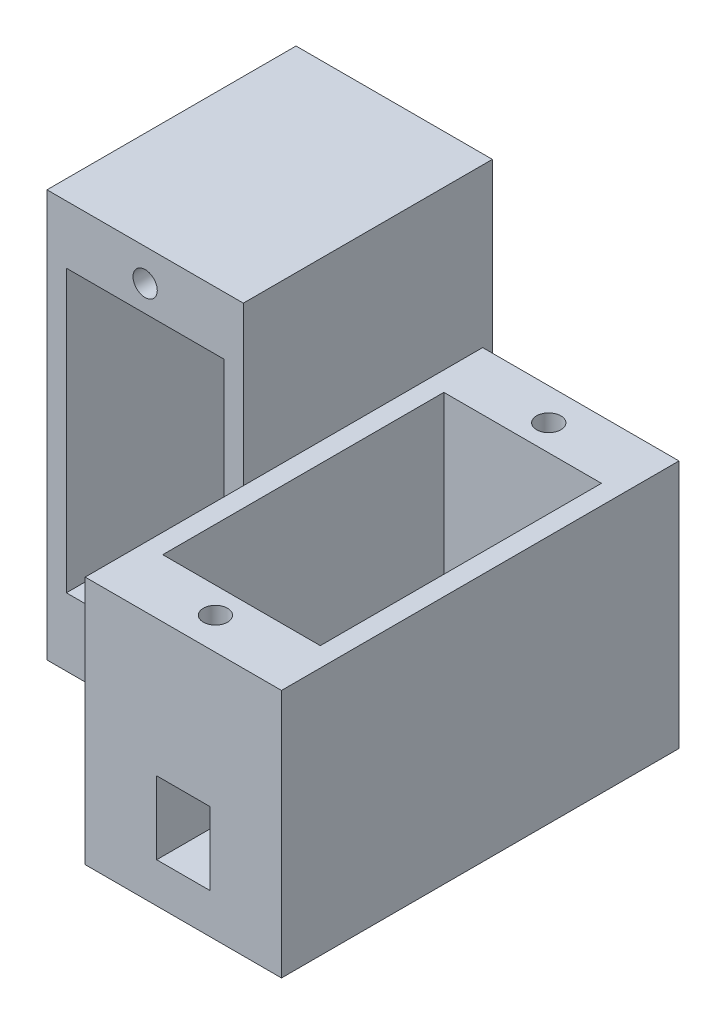
ISO-10303-21;
HEADER;
FILE_DESCRIPTION(('STEP AP214'),'2;1');
FILE_NAME('part.step','',(''),(''),'','','');
FILE_SCHEMA(('AUTOMOTIVE_DESIGN { 1 0 10303 214 1 1 1 1 }'));
ENDSEC;
DATA;
#1=APPLICATION_CONTEXT('core data for automotive mechanical design processes');
#2=APPLICATION_PROTOCOL_DEFINITION('international standard','automotive_design',2000,#1);
#3=PRODUCT_CONTEXT('',#1,'mechanical');
#4=PRODUCT('Part','Part','',(#3));
#5=PRODUCT_RELATED_PRODUCT_CATEGORY('part','',(#4));
#6=PRODUCT_DEFINITION_FORMATION('','',#4);
#7=PRODUCT_DEFINITION_CONTEXT('part definition',#1,'design');
#8=PRODUCT_DEFINITION('design','',#6,#7);
#9=PRODUCT_DEFINITION_SHAPE('','',#8);
#10=(LENGTH_UNIT() NAMED_UNIT(*) SI_UNIT(.MILLI.,.METRE.));
#11=(NAMED_UNIT(*) PLANE_ANGLE_UNIT() SI_UNIT($,.RADIAN.));
#12=(NAMED_UNIT(*) SI_UNIT($,.STERADIAN.) SOLID_ANGLE_UNIT());
#13=UNCERTAINTY_MEASURE_WITH_UNIT(LENGTH_MEASURE(1.E-05),#10,'distance_accuracy_value','');
#14=(GEOMETRIC_REPRESENTATION_CONTEXT(3) GLOBAL_UNCERTAINTY_ASSIGNED_CONTEXT((#13)) GLOBAL_UNIT_ASSIGNED_CONTEXT((#10,
#11,#12)) REPRESENTATION_CONTEXT('',''));
#15=CARTESIAN_POINT('',(0.,0.,0.));
#16=DIRECTION('',(0.,0.,1.));
#17=DIRECTION('',(1.,0.,0.));
#18=AXIS2_PLACEMENT_3D('',#15,#16,#17);
#19=CARTESIAN_POINT('',(-8.1,27.35,10.9));
#20=DIRECTION('',(1.,0.,0.));
#21=DIRECTION('',(0.,0.,-1.));
#22=AXIS2_PLACEMENT_3D('',#19,#20,#21);
#23=PLANE('',#22);
#24=DIRECTION('',(0.,1.,0.));
#25=VECTOR('',#24,1.);
#26=CARTESIAN_POINT('',(-8.1,7.6,-2.15));
#27=LINE('',#26,#25);
#28=CARTESIAN_POINT('',(-8.1,6.8,-2.15));
#29=VERTEX_POINT('',#28);
#30=CARTESIAN_POINT('',(-8.1,27.35,-2.15));
#31=VERTEX_POINT('',#30);
#32=EDGE_CURVE('E449',#29,#31,#27,.T.);
#33=ORIENTED_EDGE('',*,*,#32,.F.);
#34=DIRECTION('',(0.,0.,1.));
#35=VECTOR('',#34,1.);
#36=CARTESIAN_POINT('',(-8.1,6.8,10.9));
#37=LINE('',#36,#35);
#38=CARTESIAN_POINT('',(-8.1,6.8,10.9));
#39=VERTEX_POINT('',#38);
#40=EDGE_CURVE('E470',#29,#39,#37,.T.);
#41=ORIENTED_EDGE('',*,*,#40,.T.);
#42=DIRECTION('',(0.,-1.,0.));
#43=VECTOR('',#42,1.);
#44=CARTESIAN_POINT('',(-8.1,27.35,10.9));
#45=LINE('',#44,#43);
#46=CARTESIAN_POINT('',(-8.1,27.35,10.9));
#47=VERTEX_POINT('',#46);
#48=EDGE_CURVE('E11',#47,#39,#45,.T.);
#49=ORIENTED_EDGE('',*,*,#48,.F.);
#50=DIRECTION('',(0.,0.,1.));
#51=VECTOR('',#50,1.);
#52=CARTESIAN_POINT('',(-8.1,27.35,10.9));
#53=LINE('',#52,#51);
#54=EDGE_CURVE('E476',#31,#47,#53,.T.);
#55=ORIENTED_EDGE('',*,*,#54,.F.);
#56=EDGE_LOOP('',(#33,#41,#49,#55));
#57=FACE_BOUND('',#56,.T.);
#58=ADVANCED_FACE('F39',(#57),#23,.F.);
#59=CARTESIAN_POINT('',(-8.1,27.35,10.9));
#60=DIRECTION('',(0.,0.,-1.));
#61=DIRECTION('',(-1.,0.,0.));
#62=AXIS2_PLACEMENT_3D('',#59,#60,#61);
#63=PLANE('',#62);
#64=DIRECTION('',(1.,0.,0.));
#65=VECTOR('',#64,1.);
#66=CARTESIAN_POINT('',(-2.2,10.1,10.9));
#67=LINE('',#66,#65);
#68=CARTESIAN_POINT('',(-2.2,10.1,10.9));
#69=VERTEX_POINT('',#68);
#70=CARTESIAN_POINT('',(2.2,10.1,10.9));
#71=VERTEX_POINT('',#70);
#72=EDGE_CURVE('E335',#69,#71,#67,.T.);
#73=ORIENTED_EDGE('',*,*,#72,.F.);
#74=DIRECTION('',(0.,-1.,0.));
#75=VECTOR('',#74,1.);
#76=CARTESIAN_POINT('',(-2.2,10.1,10.9));
#77=LINE('',#76,#75);
#78=CARTESIAN_POINT('',(-2.2,16.1,10.9));
#79=VERTEX_POINT('',#78);
#80=EDGE_CURVE('E310',#79,#69,#77,.T.);
#81=ORIENTED_EDGE('',*,*,#80,.F.);
#82=DIRECTION('',(-1.,0.,0.));
#83=VECTOR('',#82,1.);
#84=CARTESIAN_POINT('',(-2.2,16.1,10.9));
#85=LINE('',#84,#83);
#86=CARTESIAN_POINT('',(2.2,16.1,10.9));
#87=VERTEX_POINT('',#86);
#88=EDGE_CURVE('E324',#87,#79,#85,.T.);
#89=ORIENTED_EDGE('',*,*,#88,.F.);
#90=DIRECTION('',(0.,1.,0.));
#91=VECTOR('',#90,1.);
#92=CARTESIAN_POINT('',(2.2,10.1,10.9));
#93=LINE('',#92,#91);
#94=EDGE_CURVE('E339',#71,#87,#93,.T.);
#95=ORIENTED_EDGE('',*,*,#94,.F.);
#96=EDGE_LOOP('',(#73,#81,#89,#95));
#97=FACE_BOUND('',#96,.T.);
#98=DIRECTION('',(1.,0.,0.));
#99=VECTOR('',#98,1.);
#100=CARTESIAN_POINT('',(-8.1,6.8,10.9));
#101=LINE('',#100,#99);
#102=CARTESIAN_POINT('',(8.1,6.8,10.9));
#103=VERTEX_POINT('',#102);
#104=EDGE_CURVE('E489',#39,#103,#101,.T.);
#105=ORIENTED_EDGE('',*,*,#104,.T.);
#106=DIRECTION('',(0.,-1.,0.));
#107=VECTOR('',#106,1.);
#108=CARTESIAN_POINT('',(8.1,27.35,10.9));
#109=LINE('',#108,#107);
#110=CARTESIAN_POINT('',(8.1,27.35,10.9));
#111=VERTEX_POINT('',#110);
#112=EDGE_CURVE('E47',#111,#103,#109,.T.);
#113=ORIENTED_EDGE('',*,*,#112,.F.);
#114=DIRECTION('',(1.,0.,0.));
#115=VECTOR('',#114,1.);
#116=CARTESIAN_POINT('',(-8.1,27.35,10.9));
#117=LINE('',#116,#115);
#118=EDGE_CURVE('E475',#47,#111,#117,.T.);
#119=ORIENTED_EDGE('',*,*,#118,.F.);
#120=ORIENTED_EDGE('',*,*,#48,.T.);
#121=EDGE_LOOP('',(#105,#113,#119,#120));
#122=FACE_BOUND('',#121,.T.);
#123=ADVANCED_FACE('F529',(#97,#122),#63,.F.);
#124=CARTESIAN_POINT('',(8.1,27.35,10.9));
#125=DIRECTION('',(-1.,0.,0.));
#126=DIRECTION('',(0.,0.,1.));
#127=AXIS2_PLACEMENT_3D('',#124,#125,#126);
#128=PLANE('',#127);
#129=DIRECTION('',(0.,0.,-1.));
#130=VECTOR('',#129,1.);
#131=CARTESIAN_POINT('',(8.1,6.8,10.9));
#132=LINE('',#131,#130);
#133=CARTESIAN_POINT('',(8.1,6.8,-21.9));
#134=VERTEX_POINT('',#133);
#135=EDGE_CURVE('E492',#103,#134,#132,.T.);
#136=ORIENTED_EDGE('',*,*,#135,.T.);
#137=DIRECTION('',(0.,-1.,0.));
#138=VECTOR('',#137,1.);
#139=CARTESIAN_POINT('',(8.1,27.35,-21.9));
#140=LINE('',#139,#138);
#141=CARTESIAN_POINT('',(8.1,27.35,-21.9));
#142=VERTEX_POINT('',#141);
#143=EDGE_CURVE('E501',#142,#134,#140,.T.);
#144=ORIENTED_EDGE('',*,*,#143,.F.);
#145=DIRECTION('',(0.,0.,-1.));
#146=VECTOR('',#145,1.);
#147=CARTESIAN_POINT('',(8.1,27.35,10.9));
#148=LINE('',#147,#146);
#149=EDGE_CURVE('E479',#111,#142,#148,.T.);
#150=ORIENTED_EDGE('',*,*,#149,.F.);
#151=ORIENTED_EDGE('',*,*,#112,.T.);
#152=EDGE_LOOP('',(#136,#144,#150,#151));
#153=FACE_BOUND('',#152,.T.);
#154=ADVANCED_FACE('F510',(#153),#128,.F.);
#155=CARTESIAN_POINT('',(-8.1,27.35,-21.9));
#156=DIRECTION('',(0.,0.,1.));
#157=DIRECTION('',(1.,0.,0.));
#158=AXIS2_PLACEMENT_3D('',#155,#156,#157);
#159=PLANE('',#158);
#160=DIRECTION('',(-1.,0.,0.));
#161=VECTOR('',#160,1.);
#162=CARTESIAN_POINT('',(-8.1,6.8,-21.9));
#163=LINE('',#162,#161);
#164=CARTESIAN_POINT('',(-8.1,6.8,-21.9));
#165=VERTEX_POINT('',#164);
#166=EDGE_CURVE('E495',#134,#165,#163,.T.);
#167=ORIENTED_EDGE('',*,*,#166,.T.);
#168=DIRECTION('',(0.,-1.,0.));
#169=VECTOR('',#168,1.);
#170=CARTESIAN_POINT('',(-8.1,27.35,-21.9));
#171=LINE('',#170,#169);
#172=CARTESIAN_POINT('',(-8.1,27.35,-21.9));
#173=VERTEX_POINT('',#172);
#174=EDGE_CURVE('E486',#173,#165,#171,.T.);
#175=ORIENTED_EDGE('',*,*,#174,.F.);
#176=DIRECTION('',(-1.,0.,0.));
#177=VECTOR('',#176,1.);
#178=CARTESIAN_POINT('',(-8.1,27.35,-21.9));
#179=LINE('',#178,#177);
#180=EDGE_CURVE('E482',#142,#173,#179,.T.);
#181=ORIENTED_EDGE('',*,*,#180,.F.);
#182=ORIENTED_EDGE('',*,*,#143,.T.);
#183=EDGE_LOOP('',(#167,#175,#181,#182));
#184=FACE_BOUND('',#183,.T.);
#185=ADVANCED_FACE('F523',(#184),#159,.F.);
#186=CARTESIAN_POINT('',(0.,27.35,0.));
#187=DIRECTION('',(0.,-1.,0.));
#188=DIRECTION('',(0.,0.,-1.));
#189=AXIS2_PLACEMENT_3D('',#186,#187,#188);
#190=PLANE('',#189);
#191=CARTESIAN_POINT('',(0.,27.35,8.25));
#192=DIRECTION('',(0.,1.,0.));
#193=DIRECTION('',(0.,0.,1.));
#194=AXIS2_PLACEMENT_3D('',#191,#192,#193);
#195=CIRCLE('',#194,1.);
#196=CARTESIAN_POINT('',(0.,27.35,9.25));
#197=VERTEX_POINT('',#196);
#198=EDGE_CURVE('E363',#197,#197,#195,.T.);
#199=ORIENTED_EDGE('',*,*,#198,.F.);
#200=EDGE_LOOP('',(#199));
#201=FACE_BOUND('',#200,.T.);
#202=CARTESIAN_POINT('',(0.,27.35,-19.25));
#203=DIRECTION('',(0.,1.,0.));
#204=DIRECTION('',(0.,0.,1.));
#205=AXIS2_PLACEMENT_3D('',#202,#203,#204);
#206=CIRCLE('',#205,1.);
#207=CARTESIAN_POINT('',(0.,27.35,-18.25));
#208=VERTEX_POINT('',#207);
#209=EDGE_CURVE('E371',#208,#208,#206,.T.);
#210=ORIENTED_EDGE('',*,*,#209,.F.);
#211=EDGE_LOOP('',(#210));
#212=FACE_BOUND('',#211,.T.);
#213=DIRECTION('',(1.,0.,0.));
#214=VECTOR('',#213,1.);
#215=CARTESIAN_POINT('',(-6.5,27.35,6.1));
#216=LINE('',#215,#214);
#217=CARTESIAN_POINT('',(-6.5,27.35,6.1));
#218=VERTEX_POINT('',#217);
#219=CARTESIAN_POINT('',(6.5,27.35,6.1));
#220=VERTEX_POINT('',#219);
#221=EDGE_CURVE('E404',#218,#220,#216,.T.);
#222=ORIENTED_EDGE('',*,*,#221,.F.);
#223=DIRECTION('',(0.,0.,1.));
#224=VECTOR('',#223,1.);
#225=CARTESIAN_POINT('',(-6.5,27.35,6.1));
#226=LINE('',#225,#224);
#227=CARTESIAN_POINT('',(-6.5,27.35,-17.1));
#228=VERTEX_POINT('',#227);
#229=EDGE_CURVE('E379',#228,#218,#226,.T.);
#230=ORIENTED_EDGE('',*,*,#229,.F.);
#231=DIRECTION('',(-1.,0.,0.));
#232=VECTOR('',#231,1.);
#233=CARTESIAN_POINT('',(-6.5,27.35,-17.1));
#234=LINE('',#233,#232);
#235=CARTESIAN_POINT('',(6.5,27.35,-17.1));
#236=VERTEX_POINT('',#235);
#237=EDGE_CURVE('E388',#236,#228,#234,.T.);
#238=ORIENTED_EDGE('',*,*,#237,.F.);
#239=DIRECTION('',(0.,0.,-1.));
#240=VECTOR('',#239,1.);
#241=CARTESIAN_POINT('',(6.5,27.35,6.1));
#242=LINE('',#241,#240);
#243=EDGE_CURVE('E408',#220,#236,#242,.T.);
#244=ORIENTED_EDGE('',*,*,#243,.F.);
#245=EDGE_LOOP('',(#222,#230,#238,#244));
#246=FACE_BOUND('',#245,.T.);
#247=EDGE_CURVE('E471',#173,#31,#53,.T.);
#248=ORIENTED_EDGE('',*,*,#247,.T.);
#249=ORIENTED_EDGE('',*,*,#54,.T.);
#250=ORIENTED_EDGE('',*,*,#118,.T.);
#251=ORIENTED_EDGE('',*,*,#149,.T.);
#252=ORIENTED_EDGE('',*,*,#180,.T.);
#253=EDGE_LOOP('',(#248,#249,#250,#251,#252));
#254=FACE_BOUND('',#253,.T.);
#255=ADVANCED_FACE('F526',(#201,#212,#246,#254),#190,.F.);
#256=CARTESIAN_POINT('',(0.,6.8,0.));
#257=DIRECTION('',(0.,-1.,0.));
#258=DIRECTION('',(0.,0.,-1.));
#259=AXIS2_PLACEMENT_3D('',#256,#257,#258);
#260=PLANE('',#259);
#261=CARTESIAN_POINT('',(0.,6.8,0.));
#262=DIRECTION('',(0.,1.,0.));
#263=DIRECTION('',(0.,0.,1.));
#264=AXIS2_PLACEMENT_3D('',#261,#262,#263);
#265=CIRCLE('',#264,3.15);
#266=CARTESIAN_POINT('',(0.,6.8,3.15));
#267=VERTEX_POINT('',#266);
#268=EDGE_CURVE('E359',#267,#267,#265,.T.);
#269=ORIENTED_EDGE('',*,*,#268,.T.);
#270=EDGE_LOOP('',(#269));
#271=FACE_BOUND('',#270,.T.);
#272=ORIENTED_EDGE('',*,*,#40,.F.);
#273=DIRECTION('',(1.,0.,0.));
#274=VECTOR('',#273,1.);
#275=CARTESIAN_POINT('',(-24.3,6.8,-2.15));
#276=LINE('',#275,#274);
#277=CARTESIAN_POINT('',(-24.3,6.8,-2.15));
#278=VERTEX_POINT('',#277);
#279=EDGE_CURVE('E431',#278,#29,#276,.T.);
#280=ORIENTED_EDGE('',*,*,#279,.F.);
#281=DIRECTION('',(0.,0.,1.));
#282=VECTOR('',#281,1.);
#283=CARTESIAN_POINT('',(-24.3,6.8,-2.15));
#284=LINE('',#283,#282);
#285=CARTESIAN_POINT('',(-24.3,6.8,-22.7));
#286=VERTEX_POINT('',#285);
#287=EDGE_CURVE('E418',#286,#278,#284,.T.);
#288=ORIENTED_EDGE('',*,*,#287,.F.);
#289=DIRECTION('',(-1.,0.,0.));
#290=VECTOR('',#289,1.);
#291=CARTESIAN_POINT('',(-24.3,6.8,-22.7));
#292=LINE('',#291,#290);
#293=CARTESIAN_POINT('',(-8.1,6.8,-22.7));
#294=VERTEX_POINT('',#293);
#295=EDGE_CURVE('E439',#294,#286,#292,.T.);
#296=ORIENTED_EDGE('',*,*,#295,.F.);
#297=DIRECTION('',(0.,0.,-1.));
#298=VECTOR('',#297,1.);
#299=CARTESIAN_POINT('',(-8.1,6.8,-2.15));
#300=LINE('',#299,#298);
#301=EDGE_CURVE('E435',#165,#294,#300,.T.);
#302=ORIENTED_EDGE('',*,*,#301,.F.);
#303=ORIENTED_EDGE('',*,*,#166,.F.);
#304=ORIENTED_EDGE('',*,*,#135,.F.);
#305=ORIENTED_EDGE('',*,*,#104,.F.);
#306=EDGE_LOOP('',(#272,#280,#288,#296,#302,#303,#304,#305));
#307=FACE_BOUND('',#306,.T.);
#308=ADVANCED_FACE('F518',(#271,#307),#260,.T.);
#309=CARTESIAN_POINT('',(-24.3,7.6,-2.15));
#310=DIRECTION('',(1.,0.,0.));
#311=DIRECTION('',(0.,0.,-1.));
#312=AXIS2_PLACEMENT_3D('',#309,#310,#311);
#313=PLANE('',#312);
#314=ORIENTED_EDGE('',*,*,#287,.T.);
#315=DIRECTION('',(0.,-1.,0.));
#316=VECTOR('',#315,1.);
#317=CARTESIAN_POINT('',(-24.3,7.6,-2.15));
#318=LINE('',#317,#316);
#319=CARTESIAN_POINT('',(-24.3,40.4,-2.15));
#320=VERTEX_POINT('',#319);
#321=EDGE_CURVE('E444',#320,#278,#318,.T.);
#322=ORIENTED_EDGE('',*,*,#321,.F.);
#323=DIRECTION('',(0.,0.,-1.));
#324=VECTOR('',#323,1.);
#325=CARTESIAN_POINT('',(-24.3,40.4,-2.15));
#326=LINE('',#325,#324);
#327=CARTESIAN_POINT('',(-24.3,40.4,-22.7));
#328=VERTEX_POINT('',#327);
#329=EDGE_CURVE('E455',#320,#328,#326,.T.);
#330=ORIENTED_EDGE('',*,*,#329,.T.);
#331=DIRECTION('',(0.,-1.,0.));
#332=VECTOR('',#331,1.);
#333=CARTESIAN_POINT('',(-24.3,7.6,-22.7));
#334=LINE('',#333,#332);
#335=EDGE_CURVE('E443',#328,#286,#334,.T.);
#336=ORIENTED_EDGE('',*,*,#335,.T.);
#337=EDGE_LOOP('',(#314,#322,#330,#336));
#338=FACE_BOUND('',#337,.T.);
#339=ADVANCED_FACE('F540',(#338),#313,.F.);
#340=CARTESIAN_POINT('',(-8.1,7.6,-2.15));
#341=DIRECTION('',(-1.,0.,0.));
#342=DIRECTION('',(0.,0.,1.));
#343=AXIS2_PLACEMENT_3D('',#340,#341,#342);
#344=PLANE('',#343);
#345=DIRECTION('',(0.,1.,0.));
#346=VECTOR('',#345,1.);
#347=CARTESIAN_POINT('',(-8.1,7.6,-22.7));
#348=LINE('',#347,#346);
#349=CARTESIAN_POINT('',(-8.1,40.4,-22.7));
#350=VERTEX_POINT('',#349);
#351=EDGE_CURVE('E458',#294,#350,#348,.T.);
#352=ORIENTED_EDGE('',*,*,#351,.T.);
#353=DIRECTION('',(0.,0.,-1.));
#354=VECTOR('',#353,1.);
#355=CARTESIAN_POINT('',(-8.1,40.4,-2.15));
#356=LINE('',#355,#354);
#357=CARTESIAN_POINT('',(-8.1,40.4,-2.15));
#358=VERTEX_POINT('',#357);
#359=EDGE_CURVE('E466',#358,#350,#356,.T.);
#360=ORIENTED_EDGE('',*,*,#359,.F.);
#361=EDGE_CURVE('E447',#31,#358,#27,.T.);
#362=ORIENTED_EDGE('',*,*,#361,.F.);
#363=ORIENTED_EDGE('',*,*,#247,.F.);
#364=ORIENTED_EDGE('',*,*,#174,.T.);
#365=ORIENTED_EDGE('',*,*,#301,.T.);
#366=EDGE_LOOP('',(#352,#360,#362,#363,#364,#365));
#367=FACE_BOUND('',#366,.T.);
#368=ADVANCED_FACE('F547',(#367),#344,.F.);
#369=CARTESIAN_POINT('',(-24.3,40.4,-2.15));
#370=DIRECTION('',(0.,-1.,0.));
#371=DIRECTION('',(0.,0.,-1.));
#372=AXIS2_PLACEMENT_3D('',#369,#370,#371);
#373=PLANE('',#372);
#374=DIRECTION('',(-1.,0.,0.));
#375=VECTOR('',#374,1.);
#376=CARTESIAN_POINT('',(-24.3,40.4,-22.7));
#377=LINE('',#376,#375);
#378=EDGE_CURVE('E448',#350,#328,#377,.T.);
#379=ORIENTED_EDGE('',*,*,#378,.T.);
#380=ORIENTED_EDGE('',*,*,#329,.F.);
#381=DIRECTION('',(-1.,0.,0.));
#382=VECTOR('',#381,1.);
#383=CARTESIAN_POINT('',(-24.3,40.4,-2.15));
#384=LINE('',#383,#382);
#385=EDGE_CURVE('E452',#358,#320,#384,.T.);
#386=ORIENTED_EDGE('',*,*,#385,.F.);
#387=ORIENTED_EDGE('',*,*,#359,.T.);
#388=EDGE_LOOP('',(#379,#380,#386,#387));
#389=FACE_BOUND('',#388,.T.);
#390=ADVANCED_FACE('F571',(#389),#373,.F.);
#391=CARTESIAN_POINT('',(0.,0.,-2.15));
#392=DIRECTION('',(0.,0.,-1.));
#393=DIRECTION('',(-1.,0.,0.));
#394=AXIS2_PLACEMENT_3D('',#391,#392,#393);
#395=PLANE('',#394);
#396=CARTESIAN_POINT('',(-16.2,10.25,-2.15));
#397=DIRECTION('',(0.,0.,1.));
#398=DIRECTION('',(1.,0.,0.));
#399=AXIS2_PLACEMENT_3D('',#396,#397,#398);
#400=CIRCLE('',#399,1.);
#401=CARTESIAN_POINT('',(-15.2,10.25,-2.15));
#402=VERTEX_POINT('',#401);
#403=EDGE_CURVE('E256',#402,#402,#400,.T.);
#404=ORIENTED_EDGE('',*,*,#403,.F.);
#405=EDGE_LOOP('',(#404));
#406=FACE_BOUND('',#405,.T.);
#407=CARTESIAN_POINT('',(-16.2,37.75,-2.15));
#408=DIRECTION('',(0.,0.,1.));
#409=DIRECTION('',(1.,0.,0.));
#410=AXIS2_PLACEMENT_3D('',#407,#408,#409);
#411=CIRCLE('',#410,1.);
#412=CARTESIAN_POINT('',(-15.2,37.75,-2.15));
#413=VERTEX_POINT('',#412);
#414=EDGE_CURVE('E264',#413,#413,#411,.T.);
#415=ORIENTED_EDGE('',*,*,#414,.F.);
#416=EDGE_LOOP('',(#415));
#417=FACE_BOUND('',#416,.T.);
#418=DIRECTION('',(1.,0.,0.));
#419=VECTOR('',#418,1.);
#420=CARTESIAN_POINT('',(-22.7,12.4,-2.15));
#421=LINE('',#420,#419);
#422=CARTESIAN_POINT('',(-22.7,12.4,-2.15));
#423=VERTEX_POINT('',#422);
#424=CARTESIAN_POINT('',(-9.7,12.4,-2.15));
#425=VERTEX_POINT('',#424);
#426=EDGE_CURVE('E296',#423,#425,#421,.T.);
#427=ORIENTED_EDGE('',*,*,#426,.F.);
#428=DIRECTION('',(0.,-1.,0.));
#429=VECTOR('',#428,1.);
#430=CARTESIAN_POINT('',(-22.7,12.4,-2.15));
#431=LINE('',#430,#429);
#432=CARTESIAN_POINT('',(-22.7,35.6,-2.15));
#433=VERTEX_POINT('',#432);
#434=EDGE_CURVE('E62',#433,#423,#431,.T.);
#435=ORIENTED_EDGE('',*,*,#434,.F.);
#436=DIRECTION('',(-1.,0.,0.));
#437=VECTOR('',#436,1.);
#438=CARTESIAN_POINT('',(-22.7,35.6,-2.15));
#439=LINE('',#438,#437);
#440=CARTESIAN_POINT('',(-9.7,35.6,-2.15));
#441=VERTEX_POINT('',#440);
#442=EDGE_CURVE('E280',#441,#433,#439,.T.);
#443=ORIENTED_EDGE('',*,*,#442,.F.);
#444=DIRECTION('',(0.,1.,0.));
#445=VECTOR('',#444,1.);
#446=CARTESIAN_POINT('',(-9.7,12.4,-2.15));
#447=LINE('',#446,#445);
#448=EDGE_CURVE('E300',#425,#441,#447,.T.);
#449=ORIENTED_EDGE('',*,*,#448,.F.);
#450=EDGE_LOOP('',(#427,#435,#443,#449));
#451=FACE_BOUND('',#450,.T.);
#452=ORIENTED_EDGE('',*,*,#32,.T.);
#453=ORIENTED_EDGE('',*,*,#361,.T.);
#454=ORIENTED_EDGE('',*,*,#385,.T.);
#455=ORIENTED_EDGE('',*,*,#321,.T.);
#456=ORIENTED_EDGE('',*,*,#279,.T.);
#457=EDGE_LOOP('',(#452,#453,#454,#455,#456));
#458=FACE_BOUND('',#457,.T.);
#459=ADVANCED_FACE('F534',(#406,#417,#451,#458),#395,.F.);
#460=CARTESIAN_POINT('',(0.,0.,-22.7));
#461=DIRECTION('',(0.,0.,-1.));
#462=DIRECTION('',(-1.,0.,0.));
#463=AXIS2_PLACEMENT_3D('',#460,#461,#462);
#464=PLANE('',#463);
#465=CARTESIAN_POINT('',(-16.2,18.5,-22.7));
#466=DIRECTION('',(0.,0.,1.));
#467=DIRECTION('',(1.,0.,0.));
#468=AXIS2_PLACEMENT_3D('',#465,#466,#467);
#469=CIRCLE('',#468,3.15);
#470=CARTESIAN_POINT('',(-13.05,18.5,-22.7));
#471=VERTEX_POINT('',#470);
#472=EDGE_CURVE('E252',#471,#471,#469,.T.);
#473=ORIENTED_EDGE('',*,*,#472,.T.);
#474=EDGE_LOOP('',(#473));
#475=FACE_BOUND('',#474,.T.);
#476=ORIENTED_EDGE('',*,*,#295,.T.);
#477=ORIENTED_EDGE('',*,*,#335,.F.);
#478=ORIENTED_EDGE('',*,*,#378,.F.);
#479=ORIENTED_EDGE('',*,*,#351,.F.);
#480=EDGE_LOOP('',(#476,#477,#478,#479));
#481=FACE_BOUND('',#480,.T.);
#482=ADVANCED_FACE('F543',(#475,#481),#464,.T.);
#483=CARTESIAN_POINT('',(-6.5,10.1,6.1));
#484=DIRECTION('',(-1.,0.,0.));
#485=DIRECTION('',(0.,0.,1.));
#486=AXIS2_PLACEMENT_3D('',#483,#484,#485);
#487=PLANE('',#486);
#488=ORIENTED_EDGE('',*,*,#229,.T.);
#489=DIRECTION('',(0.,1.,0.));
#490=VECTOR('',#489,1.);
#491=CARTESIAN_POINT('',(-6.5,10.1,6.1));
#492=LINE('',#491,#490);
#493=CARTESIAN_POINT('',(-6.5,10.1,6.1));
#494=VERTEX_POINT('',#493);
#495=EDGE_CURVE('E401',#494,#218,#492,.T.);
#496=ORIENTED_EDGE('',*,*,#495,.F.);
#497=DIRECTION('',(0.,0.,1.));
#498=VECTOR('',#497,1.);
#499=CARTESIAN_POINT('',(-6.5,10.1,6.1));
#500=LINE('',#499,#498);
#501=CARTESIAN_POINT('',(-6.5,10.1,-17.1));
#502=VERTEX_POINT('',#501);
#503=EDGE_CURVE('E383',#502,#494,#500,.T.);
#504=ORIENTED_EDGE('',*,*,#503,.F.);
#505=DIRECTION('',(0.,1.,0.));
#506=VECTOR('',#505,1.);
#507=CARTESIAN_POINT('',(-6.5,10.1,-17.1));
#508=LINE('',#507,#506);
#509=EDGE_CURVE('E415',#502,#228,#508,.T.);
#510=ORIENTED_EDGE('',*,*,#509,.T.);
#511=EDGE_LOOP('',(#488,#496,#504,#510));
#512=FACE_BOUND('',#511,.T.);
#513=ADVANCED_FACE('F578',(#512),#487,.F.);
#514=CARTESIAN_POINT('',(-6.5,10.1,-17.1));
#515=DIRECTION('',(0.,0.,-1.));
#516=DIRECTION('',(-1.,0.,0.));
#517=AXIS2_PLACEMENT_3D('',#514,#515,#516);
#518=PLANE('',#517);
#519=ORIENTED_EDGE('',*,*,#237,.T.);
#520=ORIENTED_EDGE('',*,*,#509,.F.);
#521=DIRECTION('',(-1.,0.,0.));
#522=VECTOR('',#521,1.);
#523=CARTESIAN_POINT('',(-6.5,10.1,-17.1));
#524=LINE('',#523,#522);
#525=CARTESIAN_POINT('',(6.5,10.1,-17.1));
#526=VERTEX_POINT('',#525);
#527=EDGE_CURVE('E397',#526,#502,#524,.T.);
#528=ORIENTED_EDGE('',*,*,#527,.F.);
#529=DIRECTION('',(0.,1.,0.));
#530=VECTOR('',#529,1.);
#531=CARTESIAN_POINT('',(6.5,10.1,-17.1));
#532=LINE('',#531,#530);
#533=EDGE_CURVE('E419',#526,#236,#532,.T.);
#534=ORIENTED_EDGE('',*,*,#533,.T.);
#535=EDGE_LOOP('',(#519,#520,#528,#534));
#536=FACE_BOUND('',#535,.T.);
#537=ADVANCED_FACE('F676',(#536),#518,.F.);
#538=CARTESIAN_POINT('',(6.5,10.1,6.1));
#539=DIRECTION('',(1.,0.,0.));
#540=DIRECTION('',(0.,0.,-1.));
#541=AXIS2_PLACEMENT_3D('',#538,#539,#540);
#542=PLANE('',#541);
#543=ORIENTED_EDGE('',*,*,#243,.T.);
#544=ORIENTED_EDGE('',*,*,#533,.F.);
#545=DIRECTION('',(0.,0.,-1.));
#546=VECTOR('',#545,1.);
#547=CARTESIAN_POINT('',(6.5,10.1,6.1));
#548=LINE('',#547,#546);
#549=CARTESIAN_POINT('',(6.5,10.1,6.1));
#550=VERTEX_POINT('',#549);
#551=EDGE_CURVE('E393',#550,#526,#548,.T.);
#552=ORIENTED_EDGE('',*,*,#551,.F.);
#553=DIRECTION('',(0.,1.,0.));
#554=VECTOR('',#553,1.);
#555=CARTESIAN_POINT('',(6.5,10.1,6.1));
#556=LINE('',#555,#554);
#557=EDGE_CURVE('E422',#550,#220,#556,.T.);
#558=ORIENTED_EDGE('',*,*,#557,.T.);
#559=EDGE_LOOP('',(#543,#544,#552,#558));
#560=FACE_BOUND('',#559,.T.);
#561=ADVANCED_FACE('F684',(#560),#542,.F.);
#562=CARTESIAN_POINT('',(-6.5,10.1,6.1));
#563=DIRECTION('',(0.,0.,1.));
#564=DIRECTION('',(1.,0.,0.));
#565=AXIS2_PLACEMENT_3D('',#562,#563,#564);
#566=PLANE('',#565);
#567=DIRECTION('',(-1.,0.,0.));
#568=VECTOR('',#567,1.);
#569=CARTESIAN_POINT('',(-2.2,16.1,6.1));
#570=LINE('',#569,#568);
#571=CARTESIAN_POINT('',(2.2,16.1,6.1));
#572=VERTEX_POINT('',#571);
#573=CARTESIAN_POINT('',(-2.2,16.1,6.1));
#574=VERTEX_POINT('',#573);
#575=EDGE_CURVE('E328',#572,#574,#570,.T.);
#576=ORIENTED_EDGE('',*,*,#575,.T.);
#577=DIRECTION('',(0.,-1.,0.));
#578=VECTOR('',#577,1.);
#579=CARTESIAN_POINT('',(-2.2,10.1,6.1));
#580=LINE('',#579,#578);
#581=CARTESIAN_POINT('',(-2.2,10.1,6.1));
#582=VERTEX_POINT('',#581);
#583=EDGE_CURVE('E319',#574,#582,#580,.T.);
#584=ORIENTED_EDGE('',*,*,#583,.T.);
#585=DIRECTION('',(1.,0.,0.));
#586=VECTOR('',#585,1.);
#587=CARTESIAN_POINT('',(-6.5,10.1,6.1));
#588=LINE('',#587,#586);
#589=EDGE_CURVE('E389',#494,#582,#588,.T.);
#590=ORIENTED_EDGE('',*,*,#589,.F.);
#591=ORIENTED_EDGE('',*,*,#495,.T.);
#592=ORIENTED_EDGE('',*,*,#221,.T.);
#593=ORIENTED_EDGE('',*,*,#557,.F.);
#594=CARTESIAN_POINT('',(2.2,10.1,6.1));
#595=VERTEX_POINT('',#594);
#596=EDGE_CURVE('E387',#595,#550,#588,.T.);
#597=ORIENTED_EDGE('',*,*,#596,.F.);
#598=DIRECTION('',(0.,1.,0.));
#599=VECTOR('',#598,1.);
#600=CARTESIAN_POINT('',(2.2,10.1,6.1));
#601=LINE('',#600,#599);
#602=EDGE_CURVE('E323',#595,#572,#601,.T.);
#603=ORIENTED_EDGE('',*,*,#602,.T.);
#604=EDGE_LOOP('',(#576,#584,#590,#591,#592,#593,#597,#603));
#605=FACE_BOUND('',#604,.T.);
#606=ADVANCED_FACE('F693',(#605),#566,.F.);
#607=CARTESIAN_POINT('',(0.,10.1,0.));
#608=DIRECTION('',(0.,-1.,0.));
#609=DIRECTION('',(0.,0.,-1.));
#610=AXIS2_PLACEMENT_3D('',#607,#608,#609);
#611=PLANE('',#610);
#612=ORIENTED_EDGE('',*,*,#503,.T.);
#613=ORIENTED_EDGE('',*,*,#589,.T.);
#614=DIRECTION('',(0.,0.,1.));
#615=VECTOR('',#614,1.);
#616=CARTESIAN_POINT('',(-2.2,10.1,6.1));
#617=LINE('',#616,#615);
#618=EDGE_CURVE('E332',#582,#69,#617,.T.);
#619=ORIENTED_EDGE('',*,*,#618,.T.);
#620=ORIENTED_EDGE('',*,*,#72,.T.);
#621=DIRECTION('',(0.,0.,1.));
#622=VECTOR('',#621,1.);
#623=CARTESIAN_POINT('',(2.2,10.1,6.1));
#624=LINE('',#623,#622);
#625=EDGE_CURVE('E353',#595,#71,#624,.T.);
#626=ORIENTED_EDGE('',*,*,#625,.F.);
#627=ORIENTED_EDGE('',*,*,#596,.T.);
#628=ORIENTED_EDGE('',*,*,#551,.T.);
#629=ORIENTED_EDGE('',*,*,#527,.T.);
#630=EDGE_LOOP('',(#612,#613,#619,#620,#626,#627,#628,#629));
#631=FACE_BOUND('',#630,.T.);
#632=ADVANCED_FACE('F703',(#631),#611,.F.);
#633=CARTESIAN_POINT('',(0.,21.35,-19.25));
#634=DIRECTION('',(0.,1.,0.));
#635=DIRECTION('',(0.,0.,1.));
#636=AXIS2_PLACEMENT_3D('',#633,#634,#635);
#637=CYLINDRICAL_SURFACE('',#636,1.);
#638=CARTESIAN_POINT('',(0.,21.35,-19.25));
#639=DIRECTION('',(0.,1.,0.));
#640=DIRECTION('',(0.,0.,1.));
#641=AXIS2_PLACEMENT_3D('',#638,#639,#640);
#642=CIRCLE('',#641,1.);
#643=CARTESIAN_POINT('',(0.,21.35,-18.25));
#644=VERTEX_POINT('',#643);
#645=EDGE_CURVE('E375',#644,#644,#642,.T.);
#646=ORIENTED_EDGE('',*,*,#645,.F.);
#647=EDGE_LOOP('',(#646));
#648=FACE_BOUND('',#647,.T.);
#649=ORIENTED_EDGE('',*,*,#209,.T.);
#650=EDGE_LOOP('',(#649));
#651=FACE_BOUND('',#650,.T.);
#652=ADVANCED_FACE('F713',(#648,#651),#637,.F.);
#653=CARTESIAN_POINT('',(0.,21.35,-19.25));
#654=DIRECTION('',(0.,1.,0.));
#655=DIRECTION('',(0.,0.,1.));
#656=AXIS2_PLACEMENT_3D('',#653,#654,#655);
#657=PLANE('',#656);
#658=ORIENTED_EDGE('',*,*,#645,.T.);
#659=EDGE_LOOP('',(#658));
#660=FACE_BOUND('',#659,.T.);
#661=ADVANCED_FACE('F724',(#660),#657,.T.);
#662=CARTESIAN_POINT('',(0.,21.35,8.25));
#663=DIRECTION('',(0.,1.,0.));
#664=DIRECTION('',(0.,0.,1.));
#665=AXIS2_PLACEMENT_3D('',#662,#663,#664);
#666=CYLINDRICAL_SURFACE('',#665,1.);
#667=CARTESIAN_POINT('',(0.,21.35,8.25));
#668=DIRECTION('',(0.,1.,0.));
#669=DIRECTION('',(0.,0.,1.));
#670=AXIS2_PLACEMENT_3D('',#667,#668,#669);
#671=CIRCLE('',#670,1.);
#672=CARTESIAN_POINT('',(0.,21.35,9.25));
#673=VERTEX_POINT('',#672);
#674=EDGE_CURVE('E367',#673,#673,#671,.T.);
#675=ORIENTED_EDGE('',*,*,#674,.F.);
#676=EDGE_LOOP('',(#675));
#677=FACE_BOUND('',#676,.T.);
#678=ORIENTED_EDGE('',*,*,#198,.T.);
#679=EDGE_LOOP('',(#678));
#680=FACE_BOUND('',#679,.T.);
#681=ADVANCED_FACE('F733',(#677,#680),#666,.F.);
#682=CARTESIAN_POINT('',(0.,21.35,8.25));
#683=DIRECTION('',(0.,1.,0.));
#684=DIRECTION('',(0.,0.,1.));
#685=AXIS2_PLACEMENT_3D('',#682,#683,#684);
#686=PLANE('',#685);
#687=ORIENTED_EDGE('',*,*,#674,.T.);
#688=EDGE_LOOP('',(#687));
#689=FACE_BOUND('',#688,.T.);
#690=ADVANCED_FACE('F743',(#689),#686,.T.);
#691=CARTESIAN_POINT('',(0.,6.8,0.));
#692=DIRECTION('',(0.,1.,0.));
#693=DIRECTION('',(0.,0.,1.));
#694=AXIS2_PLACEMENT_3D('',#691,#692,#693);
#695=CYLINDRICAL_SURFACE('',#694,3.15);
#696=ORIENTED_EDGE('',*,*,#268,.F.);
#697=EDGE_LOOP('',(#696));
#698=FACE_BOUND('',#697,.T.);
#699=CARTESIAN_POINT('',(0.,9.4,0.));
#700=DIRECTION('',(0.,1.,0.));
#701=DIRECTION('',(0.,0.,1.));
#702=AXIS2_PLACEMENT_3D('',#699,#700,#701);
#703=CIRCLE('',#702,3.15);
#704=CARTESIAN_POINT('',(0.,9.4,3.15));
#705=VERTEX_POINT('',#704);
#706=EDGE_CURVE('E349',#705,#705,#703,.T.);
#707=ORIENTED_EDGE('',*,*,#706,.T.);
#708=EDGE_LOOP('',(#707));
#709=FACE_BOUND('',#708,.T.);
#710=ADVANCED_FACE('F752',(#698,#709),#695,.F.);
#711=CARTESIAN_POINT('',(0.,9.4,0.));
#712=DIRECTION('',(0.,1.,0.));
#713=DIRECTION('',(0.,0.,1.));
#714=AXIS2_PLACEMENT_3D('',#711,#712,#713);
#715=PLANE('',#714);
#716=ORIENTED_EDGE('',*,*,#706,.F.);
#717=EDGE_LOOP('',(#716));
#718=FACE_BOUND('',#717,.T.);
#719=ADVANCED_FACE('F760',(#718),#715,.F.);
#720=CARTESIAN_POINT('',(-2.2,10.1,6.1));
#721=DIRECTION('',(-1.,0.,0.));
#722=DIRECTION('',(0.,0.,1.));
#723=AXIS2_PLACEMENT_3D('',#720,#721,#722);
#724=PLANE('',#723);
#725=ORIENTED_EDGE('',*,*,#80,.T.);
#726=ORIENTED_EDGE('',*,*,#618,.F.);
#727=ORIENTED_EDGE('',*,*,#583,.F.);
#728=DIRECTION('',(0.,0.,1.));
#729=VECTOR('',#728,1.);
#730=CARTESIAN_POINT('',(-2.2,16.1,6.1));
#731=LINE('',#730,#729);
#732=EDGE_CURVE('E346',#574,#79,#731,.T.);
#733=ORIENTED_EDGE('',*,*,#732,.T.);
#734=EDGE_LOOP('',(#725,#726,#727,#733));
#735=FACE_BOUND('',#734,.T.);
#736=ADVANCED_FACE('F768',(#735),#724,.F.);
#737=CARTESIAN_POINT('',(-2.2,16.1,6.1));
#738=DIRECTION('',(0.,1.,0.));
#739=DIRECTION('',(0.,0.,1.));
#740=AXIS2_PLACEMENT_3D('',#737,#738,#739);
#741=PLANE('',#740);
#742=ORIENTED_EDGE('',*,*,#88,.T.);
#743=ORIENTED_EDGE('',*,*,#732,.F.);
#744=ORIENTED_EDGE('',*,*,#575,.F.);
#745=DIRECTION('',(0.,0.,1.));
#746=VECTOR('',#745,1.);
#747=CARTESIAN_POINT('',(2.2,16.1,6.1));
#748=LINE('',#747,#746);
#749=EDGE_CURVE('E350',#572,#87,#748,.T.);
#750=ORIENTED_EDGE('',*,*,#749,.T.);
#751=EDGE_LOOP('',(#742,#743,#744,#750));
#752=FACE_BOUND('',#751,.T.);
#753=ADVANCED_FACE('F784',(#752),#741,.F.);
#754=CARTESIAN_POINT('',(2.2,10.1,6.1));
#755=DIRECTION('',(1.,0.,0.));
#756=DIRECTION('',(0.,0.,-1.));
#757=AXIS2_PLACEMENT_3D('',#754,#755,#756);
#758=PLANE('',#757);
#759=ORIENTED_EDGE('',*,*,#94,.T.);
#760=ORIENTED_EDGE('',*,*,#749,.F.);
#761=ORIENTED_EDGE('',*,*,#602,.F.);
#762=ORIENTED_EDGE('',*,*,#625,.T.);
#763=EDGE_LOOP('',(#759,#760,#761,#762));
#764=FACE_BOUND('',#763,.T.);
#765=ADVANCED_FACE('F791',(#764),#758,.F.);
#766=CARTESIAN_POINT('',(-22.7,12.4,-19.4));
#767=DIRECTION('',(-1.,0.,0.));
#768=DIRECTION('',(0.,0.,1.));
#769=AXIS2_PLACEMENT_3D('',#766,#767,#768);
#770=PLANE('',#769);
#771=ORIENTED_EDGE('',*,*,#434,.T.);
#772=DIRECTION('',(0.,0.,1.));
#773=VECTOR('',#772,1.);
#774=CARTESIAN_POINT('',(-22.7,12.4,-19.4));
#775=LINE('',#774,#773);
#776=CARTESIAN_POINT('',(-22.7,12.4,-19.4));
#777=VERTEX_POINT('',#776);
#778=EDGE_CURVE('E293',#777,#423,#775,.T.);
#779=ORIENTED_EDGE('',*,*,#778,.F.);
#780=DIRECTION('',(0.,-1.,0.));
#781=VECTOR('',#780,1.);
#782=CARTESIAN_POINT('',(-22.7,12.4,-19.4));
#783=LINE('',#782,#781);
#784=CARTESIAN_POINT('',(-22.7,35.6,-19.4));
#785=VERTEX_POINT('',#784);
#786=EDGE_CURVE('E275',#785,#777,#783,.T.);
#787=ORIENTED_EDGE('',*,*,#786,.F.);
#788=DIRECTION('',(0.,0.,1.));
#789=VECTOR('',#788,1.);
#790=CARTESIAN_POINT('',(-22.7,35.6,-19.4));
#791=LINE('',#790,#789);
#792=EDGE_CURVE('E307',#785,#433,#791,.T.);
#793=ORIENTED_EDGE('',*,*,#792,.T.);
#794=EDGE_LOOP('',(#771,#779,#787,#793));
#795=FACE_BOUND('',#794,.T.);
#796=ADVANCED_FACE('F568',(#795),#770,.F.);
#797=CARTESIAN_POINT('',(-22.7,35.6,-19.4));
#798=DIRECTION('',(0.,1.,0.));
#799=DIRECTION('',(0.,0.,1.));
#800=AXIS2_PLACEMENT_3D('',#797,#798,#799);
#801=PLANE('',#800);
#802=ORIENTED_EDGE('',*,*,#442,.T.);
#803=ORIENTED_EDGE('',*,*,#792,.F.);
#804=DIRECTION('',(-1.,0.,0.));
#805=VECTOR('',#804,1.);
#806=CARTESIAN_POINT('',(-22.7,35.6,-19.4));
#807=LINE('',#806,#805);
#808=CARTESIAN_POINT('',(-9.7,35.6,-19.4));
#809=VERTEX_POINT('',#808);
#810=EDGE_CURVE('E289',#809,#785,#807,.T.);
#811=ORIENTED_EDGE('',*,*,#810,.F.);
#812=DIRECTION('',(0.,0.,1.));
#813=VECTOR('',#812,1.);
#814=CARTESIAN_POINT('',(-9.7,35.6,-19.4));
#815=LINE('',#814,#813);
#816=EDGE_CURVE('E311',#809,#441,#815,.T.);
#817=ORIENTED_EDGE('',*,*,#816,.T.);
#818=EDGE_LOOP('',(#802,#803,#811,#817));
#819=FACE_BOUND('',#818,.T.);
#820=ADVANCED_FACE('F565',(#819),#801,.F.);
#821=CARTESIAN_POINT('',(-9.7,12.4,-19.4));
#822=DIRECTION('',(1.,0.,0.));
#823=DIRECTION('',(0.,0.,-1.));
#824=AXIS2_PLACEMENT_3D('',#821,#822,#823);
#825=PLANE('',#824);
#826=ORIENTED_EDGE('',*,*,#448,.T.);
#827=ORIENTED_EDGE('',*,*,#816,.F.);
#828=DIRECTION('',(0.,1.,0.));
#829=VECTOR('',#828,1.);
#830=CARTESIAN_POINT('',(-9.7,12.4,-19.4));
#831=LINE('',#830,#829);
#832=CARTESIAN_POINT('',(-9.7,12.4,-19.4));
#833=VERTEX_POINT('',#832);
#834=EDGE_CURVE('E285',#833,#809,#831,.T.);
#835=ORIENTED_EDGE('',*,*,#834,.F.);
#836=DIRECTION('',(0.,0.,1.));
#837=VECTOR('',#836,1.);
#838=CARTESIAN_POINT('',(-9.7,12.4,-19.4));
#839=LINE('',#838,#837);
#840=EDGE_CURVE('E314',#833,#425,#839,.T.);
#841=ORIENTED_EDGE('',*,*,#840,.T.);
#842=EDGE_LOOP('',(#826,#827,#835,#841));
#843=FACE_BOUND('',#842,.T.);
#844=ADVANCED_FACE('F562',(#843),#825,.F.);
#845=CARTESIAN_POINT('',(-22.7,12.4,-19.4));
#846=DIRECTION('',(0.,-1.,0.));
#847=DIRECTION('',(0.,0.,-1.));
#848=AXIS2_PLACEMENT_3D('',#845,#846,#847);
#849=PLANE('',#848);
#850=DIRECTION('',(1.,0.,0.));
#851=VECTOR('',#850,1.);
#852=CARTESIAN_POINT('',(-18.4,12.4,-13.4));
#853=LINE('',#852,#851);
#854=CARTESIAN_POINT('',(-18.4,12.4,-13.4));
#855=VERTEX_POINT('',#854);
#856=CARTESIAN_POINT('',(-14.,12.4,-13.4));
#857=VERTEX_POINT('',#856);
#858=EDGE_CURVE('E232',#855,#857,#853,.T.);
#859=ORIENTED_EDGE('',*,*,#858,.F.);
#860=DIRECTION('',(0.,0.,1.));
#861=VECTOR('',#860,1.);
#862=CARTESIAN_POINT('',(-18.4,12.4,-13.4));
#863=LINE('',#862,#861);
#864=CARTESIAN_POINT('',(-18.4,12.4,-19.4));
#865=VERTEX_POINT('',#864);
#866=EDGE_CURVE('E210',#865,#855,#863,.T.);
#867=ORIENTED_EDGE('',*,*,#866,.F.);
#868=DIRECTION('',(1.,0.,0.));
#869=VECTOR('',#868,1.);
#870=CARTESIAN_POINT('',(-22.7,12.4,-19.4));
#871=LINE('',#870,#869);
#872=EDGE_CURVE('E281',#777,#865,#871,.T.);
#873=ORIENTED_EDGE('',*,*,#872,.F.);
#874=ORIENTED_EDGE('',*,*,#778,.T.);
#875=ORIENTED_EDGE('',*,*,#426,.T.);
#876=ORIENTED_EDGE('',*,*,#840,.F.);
#877=CARTESIAN_POINT('',(-14.,12.4,-19.4));
#878=VERTEX_POINT('',#877);
#879=EDGE_CURVE('E279',#878,#833,#871,.T.);
#880=ORIENTED_EDGE('',*,*,#879,.F.);
#881=DIRECTION('',(0.,0.,-1.));
#882=VECTOR('',#881,1.);
#883=CARTESIAN_POINT('',(-14.,12.4,-13.4));
#884=LINE('',#883,#882);
#885=EDGE_CURVE('E54',#857,#878,#884,.T.);
#886=ORIENTED_EDGE('',*,*,#885,.F.);
#887=EDGE_LOOP('',(#859,#867,#873,#874,#875,#876,#880,#886));
#888=FACE_BOUND('',#887,.T.);
#889=ADVANCED_FACE('F558',(#888),#849,.F.);
#890=CARTESIAN_POINT('',(0.,0.,-19.4));
#891=DIRECTION('',(0.,0.,-1.));
#892=DIRECTION('',(-1.,0.,0.));
#893=AXIS2_PLACEMENT_3D('',#890,#891,#892);
#894=PLANE('',#893);
#895=ORIENTED_EDGE('',*,*,#786,.T.);
#896=ORIENTED_EDGE('',*,*,#872,.T.);
#897=DIRECTION('',(0.,1.,0.));
#898=VECTOR('',#897,1.);
#899=CARTESIAN_POINT('',(-18.4,7.6,-19.4));
#900=LINE('',#899,#898);
#901=CARTESIAN_POINT('',(-18.4,7.6,-19.4));
#902=VERTEX_POINT('',#901);
#903=EDGE_CURVE('E243',#902,#865,#900,.T.);
#904=ORIENTED_EDGE('',*,*,#903,.F.);
#905=DIRECTION('',(-1.,0.,0.));
#906=VECTOR('',#905,1.);
#907=CARTESIAN_POINT('',(-18.4,7.6,-19.4));
#908=LINE('',#907,#906);
#909=CARTESIAN_POINT('',(-14.,7.6,-19.4));
#910=VERTEX_POINT('',#909);
#911=EDGE_CURVE('E216',#910,#902,#908,.T.);
#912=ORIENTED_EDGE('',*,*,#911,.F.);
#913=DIRECTION('',(0.,1.,0.));
#914=VECTOR('',#913,1.);
#915=CARTESIAN_POINT('',(-14.,7.6,-19.4));
#916=LINE('',#915,#914);
#917=EDGE_CURVE('E247',#910,#878,#916,.T.);
#918=ORIENTED_EDGE('',*,*,#917,.T.);
#919=ORIENTED_EDGE('',*,*,#879,.T.);
#920=ORIENTED_EDGE('',*,*,#834,.T.);
#921=ORIENTED_EDGE('',*,*,#810,.T.);
#922=EDGE_LOOP('',(#895,#896,#904,#912,#918,#919,#920,#921));
#923=FACE_BOUND('',#922,.T.);
#924=ADVANCED_FACE('F554',(#923),#894,.F.);
#925=CARTESIAN_POINT('',(-16.2,37.75,-8.15));
#926=DIRECTION('',(0.,0.,1.));
#927=DIRECTION('',(1.,0.,0.));
#928=AXIS2_PLACEMENT_3D('',#925,#926,#927);
#929=CYLINDRICAL_SURFACE('',#928,1.);
#930=CARTESIAN_POINT('',(-16.2,37.75,-8.15));
#931=DIRECTION('',(0.,0.,1.));
#932=DIRECTION('',(1.,0.,0.));
#933=AXIS2_PLACEMENT_3D('',#930,#931,#932);
#934=CIRCLE('',#933,1.);
#935=CARTESIAN_POINT('',(-15.2,37.75,-8.15));
#936=VERTEX_POINT('',#935);
#937=EDGE_CURVE('E268',#936,#936,#934,.T.);
#938=ORIENTED_EDGE('',*,*,#937,.F.);
#939=EDGE_LOOP('',(#938));
#940=FACE_BOUND('',#939,.T.);
#941=ORIENTED_EDGE('',*,*,#414,.T.);
#942=EDGE_LOOP('',(#941));
#943=FACE_BOUND('',#942,.T.);
#944=ADVANCED_FACE('F832',(#940,#943),#929,.F.);
#945=CARTESIAN_POINT('',(-16.2,37.75,-8.15));
#946=DIRECTION('',(0.,0.,1.));
#947=DIRECTION('',(1.,0.,0.));
#948=AXIS2_PLACEMENT_3D('',#945,#946,#947);
#949=PLANE('',#948);
#950=ORIENTED_EDGE('',*,*,#937,.T.);
#951=EDGE_LOOP('',(#950));
#952=FACE_BOUND('',#951,.T.);
#953=ADVANCED_FACE('F839',(#952),#949,.T.);
#954=CARTESIAN_POINT('',(-16.2,10.25,-8.15));
#955=DIRECTION('',(0.,0.,1.));
#956=DIRECTION('',(1.,0.,0.));
#957=AXIS2_PLACEMENT_3D('',#954,#955,#956);
#958=CYLINDRICAL_SURFACE('',#957,1.);
#959=CARTESIAN_POINT('',(-16.2,10.25,-8.15));
#960=DIRECTION('',(0.,0.,1.));
#961=DIRECTION('',(1.,0.,0.));
#962=AXIS2_PLACEMENT_3D('',#959,#960,#961);
#963=CIRCLE('',#962,1.);
#964=CARTESIAN_POINT('',(-15.2,10.25,-8.15));
#965=VERTEX_POINT('',#964);
#966=EDGE_CURVE('E260',#965,#965,#963,.T.);
#967=ORIENTED_EDGE('',*,*,#966,.F.);
#968=EDGE_LOOP('',(#967));
#969=FACE_BOUND('',#968,.T.);
#970=ORIENTED_EDGE('',*,*,#403,.T.);
#971=EDGE_LOOP('',(#970));
#972=FACE_BOUND('',#971,.T.);
#973=ADVANCED_FACE('F846',(#969,#972),#958,.F.);
#974=CARTESIAN_POINT('',(-16.2,10.25,-8.15));
#975=DIRECTION('',(0.,0.,1.));
#976=DIRECTION('',(1.,0.,0.));
#977=AXIS2_PLACEMENT_3D('',#974,#975,#976);
#978=PLANE('',#977);
#979=ORIENTED_EDGE('',*,*,#966,.T.);
#980=EDGE_LOOP('',(#979));
#981=FACE_BOUND('',#980,.T.);
#982=ADVANCED_FACE('F853',(#981),#978,.T.);
#983=CARTESIAN_POINT('',(-16.2,18.5,-22.7));
#984=DIRECTION('',(0.,0.,1.));
#985=DIRECTION('',(1.,0.,0.));
#986=AXIS2_PLACEMENT_3D('',#983,#984,#985);
#987=CYLINDRICAL_SURFACE('',#986,3.15);
#988=CARTESIAN_POINT('',(-16.2,18.5,-20.1));
#989=DIRECTION('',(0.,0.,1.));
#990=DIRECTION('',(1.,0.,0.));
#991=AXIS2_PLACEMENT_3D('',#988,#989,#990);
#992=CIRCLE('',#991,3.15);
#993=CARTESIAN_POINT('',(-13.05,18.5,-20.1));
#994=VERTEX_POINT('',#993);
#995=EDGE_CURVE('E246',#994,#994,#992,.T.);
#996=CARTESIAN_POINT('',(-13.05,18.5,-22.7));
#997=CARTESIAN_POINT('',(-13.05,18.5,-22.6729166666667));
#998=CARTESIAN_POINT('',(-13.05,18.5,-22.6458333333333));
#999=CARTESIAN_POINT('',(-13.05,18.5,-22.5916666666667));
#1000=CARTESIAN_POINT('',(-13.05,18.5,-22.5645833333333));
#1001=CARTESIAN_POINT('',(-13.05,18.5,-22.5104166666667));
#1002=CARTESIAN_POINT('',(-13.05,18.5,-22.4833333333333));
#1003=CARTESIAN_POINT('',(-13.05,18.5,-22.4291666666667));
#1004=CARTESIAN_POINT('',(-13.05,18.5,-22.4020833333333));
#1005=CARTESIAN_POINT('',(-13.05,18.5,-22.3479166666667));
#1006=CARTESIAN_POINT('',(-13.05,18.5,-22.3208333333333));
#1007=CARTESIAN_POINT('',(-13.05,18.5,-22.2666666666667));
#1008=CARTESIAN_POINT('',(-13.05,18.5,-22.2395833333333));
#1009=CARTESIAN_POINT('',(-13.05,18.5,-22.1854166666667));
#1010=CARTESIAN_POINT('',(-13.05,18.5,-22.1583333333333));
#1011=CARTESIAN_POINT('',(-13.05,18.5,-22.1041666666667));
#1012=CARTESIAN_POINT('',(-13.05,18.5,-22.0770833333333));
#1013=CARTESIAN_POINT('',(-13.05,18.5,-22.0229166666667));
#1014=CARTESIAN_POINT('',(-13.05,18.5,-21.9958333333333));
#1015=CARTESIAN_POINT('',(-13.05,18.5,-21.9416666666667));
#1016=CARTESIAN_POINT('',(-13.05,18.5,-21.9145833333333));
#1017=CARTESIAN_POINT('',(-13.05,18.5,-21.8604166666667));
#1018=CARTESIAN_POINT('',(-13.05,18.5,-21.8333333333333));
#1019=CARTESIAN_POINT('',(-13.05,18.5,-21.7791666666667));
#1020=CARTESIAN_POINT('',(-13.05,18.5,-21.7520833333333));
#1021=CARTESIAN_POINT('',(-13.05,18.5,-21.6979166666667));
#1022=CARTESIAN_POINT('',(-13.05,18.5,-21.6708333333333));
#1023=CARTESIAN_POINT('',(-13.05,18.5,-21.6166666666667));
#1024=CARTESIAN_POINT('',(-13.05,18.5,-21.5895833333333));
#1025=CARTESIAN_POINT('',(-13.05,18.5,-21.5354166666667));
#1026=CARTESIAN_POINT('',(-13.05,18.5,-21.5083333333333));
#1027=CARTESIAN_POINT('',(-13.05,18.5,-21.4541666666667));
#1028=CARTESIAN_POINT('',(-13.05,18.5,-21.4270833333333));
#1029=CARTESIAN_POINT('',(-13.05,18.5,-21.3729166666667));
#1030=CARTESIAN_POINT('',(-13.05,18.5,-21.3458333333333));
#1031=CARTESIAN_POINT('',(-13.05,18.5,-21.2916666666667));
#1032=CARTESIAN_POINT('',(-13.05,18.5,-21.2645833333333));
#1033=CARTESIAN_POINT('',(-13.05,18.5,-21.2104166666667));
#1034=CARTESIAN_POINT('',(-13.05,18.5,-21.1833333333333));
#1035=CARTESIAN_POINT('',(-13.05,18.5,-21.1291666666667));
#1036=CARTESIAN_POINT('',(-13.05,18.5,-21.1020833333333));
#1037=CARTESIAN_POINT('',(-13.05,18.5,-21.0479166666667));
#1038=CARTESIAN_POINT('',(-13.05,18.5,-21.0208333333333));
#1039=CARTESIAN_POINT('',(-13.05,18.5,-20.9666666666667));
#1040=CARTESIAN_POINT('',(-13.05,18.5,-20.9395833333333));
#1041=CARTESIAN_POINT('',(-13.05,18.5,-20.8854166666667));
#1042=CARTESIAN_POINT('',(-13.05,18.5,-20.8583333333333));
#1043=CARTESIAN_POINT('',(-13.05,18.5,-20.8041666666667));
#1044=CARTESIAN_POINT('',(-13.05,18.5,-20.7770833333333));
#1045=CARTESIAN_POINT('',(-13.05,18.5,-20.7229166666667));
#1046=CARTESIAN_POINT('',(-13.05,18.5,-20.6958333333333));
#1047=CARTESIAN_POINT('',(-13.05,18.5,-20.6416666666667));
#1048=CARTESIAN_POINT('',(-13.05,18.5,-20.6145833333333));
#1049=CARTESIAN_POINT('',(-13.05,18.5,-20.5604166666667));
#1050=CARTESIAN_POINT('',(-13.05,18.5,-20.5333333333333));
#1051=CARTESIAN_POINT('',(-13.05,18.5,-20.4791666666667));
#1052=CARTESIAN_POINT('',(-13.05,18.5,-20.4520833333333));
#1053=CARTESIAN_POINT('',(-13.05,18.5,-20.3979166666667));
#1054=CARTESIAN_POINT('',(-13.05,18.5,-20.3708333333333));
#1055=CARTESIAN_POINT('',(-13.05,18.5,-20.3166666666667));
#1056=CARTESIAN_POINT('',(-13.05,18.5,-20.2895833333333));
#1057=CARTESIAN_POINT('',(-13.05,18.5,-20.2354166666667));
#1058=CARTESIAN_POINT('',(-13.05,18.5,-20.2083333333333));
#1059=CARTESIAN_POINT('',(-13.05,18.5,-20.1541666666667));
#1060=CARTESIAN_POINT('',(-13.05,18.5,-20.1270833333333));
#1061=CARTESIAN_POINT('',(-13.05,18.5,-20.1));
#1062=B_SPLINE_CURVE_WITH_KNOTS('',3,(#996,#997,#998,#999,#1000,#1001,#1002,#1003,#1004,#1005,
#1006,#1007,#1008,#1009,#1010,#1011,#1012,#1013,#1014,#1015,#1016,#1017,#1018,#1019,#1020,#1021,
#1022,#1023,#1024,#1025,#1026,#1027,#1028,#1029,#1030,#1031,#1032,#1033,#1034,#1035,#1036,#1037,
#1038,#1039,#1040,#1041,#1042,#1043,#1044,#1045,#1046,#1047,#1048,#1049,#1050,#1051,#1052,#1053,
#1054,#1055,#1056,#1057,#1058,#1059,#1060,#1061),.UNSPECIFIED.,.F.,.F.,(4,2,2,2,2,2,2,2,2,2,2,2,
2,2,2,2,2,2,2,2,2,2,2,2,2,2,2,2,2,2,2,2,4),(0.,0.0812500000000015,0.162500000000003,
0.243750000000001,0.325000000000002,0.40625,0.487500000000002,0.56875,0.650000000000001,
0.731250000000003,0.812500000000001,0.893750000000002,0.975,1.05625,1.1375,1.21875,1.3,1.38125,
1.4625,1.54375,1.625,1.70625,1.7875,1.86875,1.95,2.03125,2.1125,2.19375,2.275,2.35625,2.4375,
2.51875,2.6),.UNSPECIFIED.);
#1063=EDGE_CURVE('BSEAM860',#471,#994,#1062,.T.);
#1064=ORIENTED_EDGE('',*,*,#472,.F.);
#1065=ORIENTED_EDGE('',*,*,#995,.T.);
#1066=ORIENTED_EDGE('',*,*,#1063,.T.);
#1067=ORIENTED_EDGE('',*,*,#1063,.F.);
#1068=EDGE_LOOP('',(#1064,#1066,#1065,#1067));
#1069=FACE_BOUND('',#1068,.T.);
#1070=ADVANCED_FACE('F860',(#1069),#987,.F.);
#1071=CARTESIAN_POINT('',(-16.2,18.5,-20.1));
#1072=DIRECTION('',(0.,0.,1.));
#1073=DIRECTION('',(1.,0.,0.));
#1074=AXIS2_PLACEMENT_3D('',#1071,#1072,#1073);
#1075=PLANE('',#1074);
#1076=ORIENTED_EDGE('',*,*,#995,.F.);
#1077=EDGE_LOOP('',(#1076));
#1078=FACE_BOUND('',#1077,.T.);
#1079=ADVANCED_FACE('F867',(#1078),#1075,.F.);
#1080=CARTESIAN_POINT('',(-18.4,7.6,-13.4));
#1081=DIRECTION('',(-1.,0.,0.));
#1082=DIRECTION('',(0.,0.,1.));
#1083=AXIS2_PLACEMENT_3D('',#1080,#1081,#1082);
#1084=PLANE('',#1083);
#1085=ORIENTED_EDGE('',*,*,#866,.T.);
#1086=DIRECTION('',(0.,1.,0.));
#1087=VECTOR('',#1086,1.);
#1088=CARTESIAN_POINT('',(-18.4,7.6,-13.4));
#1089=LINE('',#1088,#1087);
#1090=CARTESIAN_POINT('',(-18.4,7.6,-13.4));
#1091=VERTEX_POINT('',#1090);
#1092=EDGE_CURVE('E203',#1091,#855,#1089,.T.);
#1093=ORIENTED_EDGE('',*,*,#1092,.F.);
#1094=DIRECTION('',(0.,0.,1.));
#1095=VECTOR('',#1094,1.);
#1096=CARTESIAN_POINT('',(-18.4,7.6,-13.4));
#1097=LINE('',#1096,#1095);
#1098=EDGE_CURVE('E207',#902,#1091,#1097,.T.);
#1099=ORIENTED_EDGE('',*,*,#1098,.F.);
#1100=ORIENTED_EDGE('',*,*,#903,.T.);
#1101=EDGE_LOOP('',(#1085,#1093,#1099,#1100));
#1102=FACE_BOUND('',#1101,.T.);
#1103=ADVANCED_FACE('F205',(#1102),#1084,.F.);
#1104=CARTESIAN_POINT('',(-14.,7.6,-13.4));
#1105=DIRECTION('',(1.,0.,0.));
#1106=DIRECTION('',(0.,0.,-1.));
#1107=AXIS2_PLACEMENT_3D('',#1104,#1105,#1106);
#1108=PLANE('',#1107);
#1109=ORIENTED_EDGE('',*,*,#885,.T.);
#1110=ORIENTED_EDGE('',*,*,#917,.F.);
#1111=DIRECTION('',(0.,0.,-1.));
#1112=VECTOR('',#1111,1.);
#1113=CARTESIAN_POINT('',(-14.,7.6,-13.4));
#1114=LINE('',#1113,#1112);
#1115=CARTESIAN_POINT('',(-14.,7.6,-13.4));
#1116=VERTEX_POINT('',#1115);
#1117=EDGE_CURVE('E225',#1116,#910,#1114,.T.);
#1118=ORIENTED_EDGE('',*,*,#1117,.F.);
#1119=DIRECTION('',(0.,1.,0.));
#1120=VECTOR('',#1119,1.);
#1121=CARTESIAN_POINT('',(-14.,7.6,-13.4));
#1122=LINE('',#1121,#1120);
#1123=EDGE_CURVE('E215',#1116,#857,#1122,.T.);
#1124=ORIENTED_EDGE('',*,*,#1123,.T.);
#1125=EDGE_LOOP('',(#1109,#1110,#1118,#1124));
#1126=FACE_BOUND('',#1125,.T.);
#1127=ADVANCED_FACE('F880',(#1126),#1108,.F.);
#1128=CARTESIAN_POINT('',(-18.4,7.6,-13.4));
#1129=DIRECTION('',(0.,0.,1.));
#1130=DIRECTION('',(1.,0.,0.));
#1131=AXIS2_PLACEMENT_3D('',#1128,#1129,#1130);
#1132=PLANE('',#1131);
#1133=ORIENTED_EDGE('',*,*,#858,.T.);
#1134=ORIENTED_EDGE('',*,*,#1123,.F.);
#1135=DIRECTION('',(1.,0.,0.));
#1136=VECTOR('',#1135,1.);
#1137=CARTESIAN_POINT('',(-18.4,7.6,-13.4));
#1138=LINE('',#1137,#1136);
#1139=EDGE_CURVE('E219',#1091,#1116,#1138,.T.);
#1140=ORIENTED_EDGE('',*,*,#1139,.F.);
#1141=ORIENTED_EDGE('',*,*,#1092,.T.);
#1142=EDGE_LOOP('',(#1133,#1134,#1140,#1141));
#1143=FACE_BOUND('',#1142,.T.);
#1144=ADVANCED_FACE('F220',(#1143),#1132,.F.);
#1145=CARTESIAN_POINT('',(0.,7.6,0.));
#1146=DIRECTION('',(0.,-1.,0.));
#1147=DIRECTION('',(0.,0.,-1.));
#1148=AXIS2_PLACEMENT_3D('',#1145,#1146,#1147);
#1149=PLANE('',#1148);
#1150=ORIENTED_EDGE('',*,*,#1098,.T.);
#1151=ORIENTED_EDGE('',*,*,#1139,.T.);
#1152=ORIENTED_EDGE('',*,*,#1117,.T.);
#1153=ORIENTED_EDGE('',*,*,#911,.T.);
#1154=EDGE_LOOP('',(#1150,#1151,#1152,#1153));
#1155=FACE_BOUND('',#1154,.T.);
#1156=ADVANCED_FACE('F227',(#1155),#1149,.F.);
#1157=CLOSED_SHELL('',(#58,#123,#154,#185,#255,#308,#339,#368,#390,#459,#482,#513,#537,#561,
#606,#632,#652,#661,#681,#690,#710,#719,#736,#753,#765,#796,#820,#844,#889,#924,#944,#953,#973,
#982,#1070,#1079,#1103,#1127,#1144,#1156));
#1158=MANIFOLD_SOLID_BREP('B2',#1157);
#1159=ADVANCED_BREP_SHAPE_REPRESENTATION('',(#18,#1158),#14);
#1160=SHAPE_DEFINITION_REPRESENTATION(#9,#1159);
ENDSEC;
END-ISO-10303-21;
